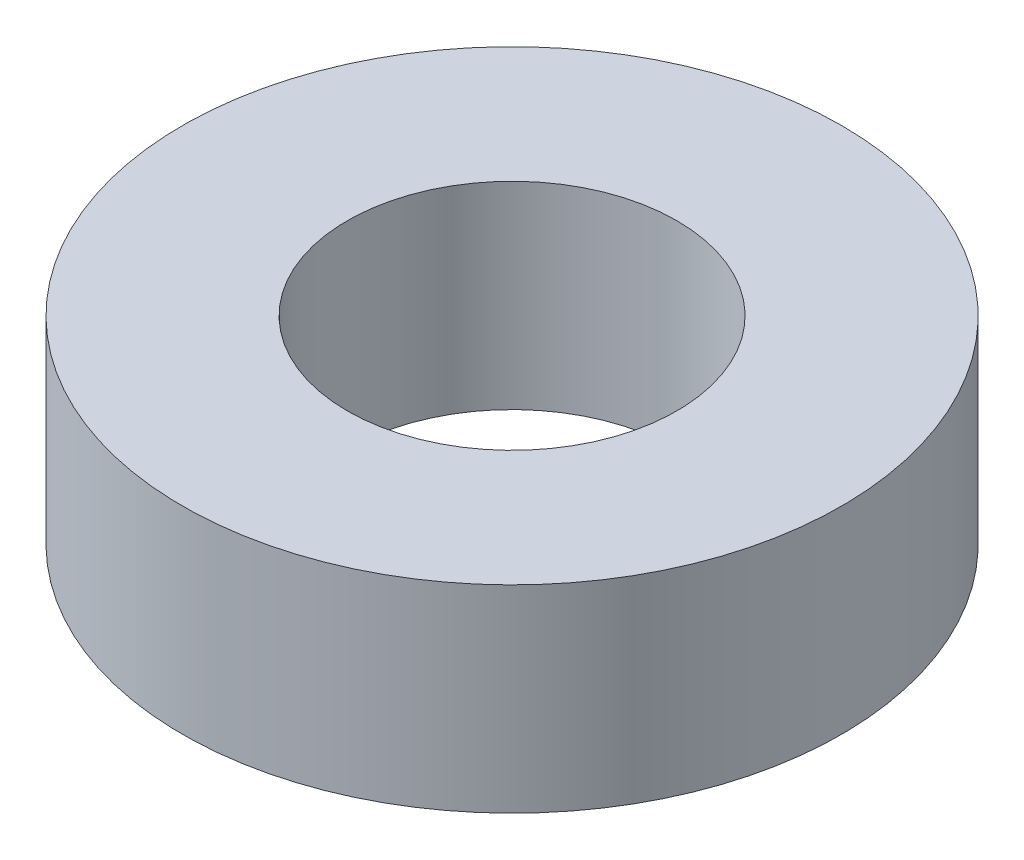
ISO-10303-21;
HEADER;
FILE_DESCRIPTION(('STEP AP214'),'2;1');
FILE_NAME('part.step','',(''),(''),'','','');
FILE_SCHEMA(('AUTOMOTIVE_DESIGN { 1 0 10303 214 1 1 1 1 }'));
ENDSEC;
DATA;
#1=APPLICATION_CONTEXT('core data for automotive mechanical design processes');
#2=APPLICATION_PROTOCOL_DEFINITION('international standard','automotive_design',2000,#1);
#3=PRODUCT_CONTEXT('',#1,'mechanical');
#4=PRODUCT('Part','Part','',(#3));
#5=PRODUCT_RELATED_PRODUCT_CATEGORY('part','',(#4));
#6=PRODUCT_DEFINITION_FORMATION('','',#4);
#7=PRODUCT_DEFINITION_CONTEXT('part definition',#1,'design');
#8=PRODUCT_DEFINITION('design','',#6,#7);
#9=PRODUCT_DEFINITION_SHAPE('','',#8);
#10=(LENGTH_UNIT() NAMED_UNIT(*) SI_UNIT(.MILLI.,.METRE.));
#11=(NAMED_UNIT(*) PLANE_ANGLE_UNIT() SI_UNIT($,.RADIAN.));
#12=(NAMED_UNIT(*) SI_UNIT($,.STERADIAN.) SOLID_ANGLE_UNIT());
#13=UNCERTAINTY_MEASURE_WITH_UNIT(LENGTH_MEASURE(1.E-05),#10,'distance_accuracy_value','');
#14=(GEOMETRIC_REPRESENTATION_CONTEXT(3) GLOBAL_UNCERTAINTY_ASSIGNED_CONTEXT((#13)) GLOBAL_UNIT_ASSIGNED_CONTEXT((#10,
#11,#12)) REPRESENTATION_CONTEXT('',''));
#15=CARTESIAN_POINT('',(0.,0.,0.));
#16=DIRECTION('',(0.,0.,1.));
#17=DIRECTION('',(1.,0.,0.));
#18=AXIS2_PLACEMENT_3D('',#15,#16,#17);
#19=CARTESIAN_POINT('',(0.,3.81,0.));
#20=DIRECTION('',(0.,1.,0.));
#21=DIRECTION('',(0.,0.,1.));
#22=AXIS2_PLACEMENT_3D('',#19,#20,#21);
#23=PLANE('',#22);
#24=CARTESIAN_POINT('',(0.,3.81,0.));
#25=DIRECTION('',(0.,1.,0.));
#26=DIRECTION('',(0.,0.,1.));
#27=AXIS2_PLACEMENT_3D('',#24,#25,#26);
#28=CIRCLE('',#27,6.35);
#29=CARTESIAN_POINT('',(0.,3.81,-6.35));
#30=VERTEX_POINT('',#29);
#31=EDGE_CURVE('E10',#30,#30,#28,.T.);
#32=ORIENTED_EDGE('',*,*,#31,.T.);
#33=EDGE_LOOP('',(#32));
#34=FACE_BOUND('',#33,.T.);
#35=CARTESIAN_POINT('',(0.,3.81,0.));
#36=DIRECTION('',(0.,1.,0.));
#37=DIRECTION('',(0.,0.,1.));
#38=AXIS2_PLACEMENT_3D('',#35,#36,#37);
#39=CIRCLE('',#38,3.175);
#40=CARTESIAN_POINT('',(0.,3.81,-3.175));
#41=VERTEX_POINT('',#40);
#42=EDGE_CURVE('E45',#41,#41,#39,.T.);
#43=ORIENTED_EDGE('',*,*,#42,.F.);
#44=EDGE_LOOP('',(#43));
#45=FACE_BOUND('',#44,.T.);
#46=ADVANCED_FACE('F34',(#34,#45),#23,.T.);
#47=CARTESIAN_POINT('',(0.,0.,0.));
#48=DIRECTION('',(0.,1.,0.));
#49=DIRECTION('',(0.,0.,1.));
#50=AXIS2_PLACEMENT_3D('',#47,#48,#49);
#51=PLANE('',#50);
#52=CARTESIAN_POINT('',(0.,0.,0.));
#53=DIRECTION('',(0.,1.,0.));
#54=DIRECTION('',(0.,0.,1.));
#55=AXIS2_PLACEMENT_3D('',#52,#53,#54);
#56=CIRCLE('',#55,6.35);
#57=CARTESIAN_POINT('',(0.,0.,-6.35));
#58=VERTEX_POINT('',#57);
#59=EDGE_CURVE('E38',#58,#58,#56,.T.);
#60=ORIENTED_EDGE('',*,*,#59,.F.);
#61=EDGE_LOOP('',(#60));
#62=FACE_BOUND('',#61,.T.);
#63=CARTESIAN_POINT('',(0.,0.,0.));
#64=DIRECTION('',(0.,1.,0.));
#65=DIRECTION('',(0.,0.,1.));
#66=AXIS2_PLACEMENT_3D('',#63,#64,#65);
#67=CIRCLE('',#66,3.175);
#68=CARTESIAN_POINT('',(0.,0.,-3.175));
#69=VERTEX_POINT('',#68);
#70=EDGE_CURVE('E47',#69,#69,#67,.T.);
#71=ORIENTED_EDGE('',*,*,#70,.T.);
#72=EDGE_LOOP('',(#71));
#73=FACE_BOUND('',#72,.T.);
#74=ADVANCED_FACE('F57',(#62,#73),#51,.F.);
#75=CARTESIAN_POINT('',(0.,3.81,0.));
#76=DIRECTION('',(0.,-1.,0.));
#77=DIRECTION('',(0.,0.,-1.));
#78=AXIS2_PLACEMENT_3D('',#75,#76,#77);
#79=CYLINDRICAL_SURFACE('',#78,6.35);
#80=CARTESIAN_POINT('',(0.,3.81,-6.35));
#81=CARTESIAN_POINT('',(0.,3.7703125,-6.35));
#82=CARTESIAN_POINT('',(0.,3.730625,-6.35));
#83=CARTESIAN_POINT('',(0.,3.65125,-6.35));
#84=CARTESIAN_POINT('',(0.,3.6115625,-6.35));
#85=CARTESIAN_POINT('',(0.,3.5321875,-6.35));
#86=CARTESIAN_POINT('',(0.,3.4925,-6.35));
#87=CARTESIAN_POINT('',(0.,3.413125,-6.35));
#88=CARTESIAN_POINT('',(0.,3.3734375,-6.35));
#89=CARTESIAN_POINT('',(0.,3.2940625,-6.35));
#90=CARTESIAN_POINT('',(0.,3.254375,-6.35));
#91=CARTESIAN_POINT('',(0.,3.175,-6.35));
#92=CARTESIAN_POINT('',(0.,3.1353125,-6.35));
#93=CARTESIAN_POINT('',(0.,3.0559375,-6.35));
#94=CARTESIAN_POINT('',(0.,3.01625,-6.35));
#95=CARTESIAN_POINT('',(0.,2.936875,-6.35));
#96=CARTESIAN_POINT('',(0.,2.8971875,-6.35));
#97=CARTESIAN_POINT('',(0.,2.8178125,-6.35));
#98=CARTESIAN_POINT('',(0.,2.778125,-6.35));
#99=CARTESIAN_POINT('',(0.,2.69875,-6.35));
#100=CARTESIAN_POINT('',(0.,2.6590625,-6.35));
#101=CARTESIAN_POINT('',(0.,2.5796875,-6.35));
#102=CARTESIAN_POINT('',(0.,2.54,-6.35));
#103=CARTESIAN_POINT('',(0.,2.460625,-6.35));
#104=CARTESIAN_POINT('',(0.,2.4209375,-6.35));
#105=CARTESIAN_POINT('',(0.,2.3415625,-6.35));
#106=CARTESIAN_POINT('',(0.,2.301875,-6.35));
#107=CARTESIAN_POINT('',(0.,2.2225,-6.35));
#108=CARTESIAN_POINT('',(0.,2.1828125,-6.35));
#109=CARTESIAN_POINT('',(0.,2.1034375,-6.35));
#110=CARTESIAN_POINT('',(0.,2.06375,-6.35));
#111=CARTESIAN_POINT('',(0.,1.984375,-6.35));
#112=CARTESIAN_POINT('',(0.,1.9446875,-6.35));
#113=CARTESIAN_POINT('',(0.,1.8653125,-6.35));
#114=CARTESIAN_POINT('',(0.,1.825625,-6.35));
#115=CARTESIAN_POINT('',(0.,1.74625,-6.35));
#116=CARTESIAN_POINT('',(0.,1.7065625,-6.35));
#117=CARTESIAN_POINT('',(0.,1.6271875,-6.35));
#118=CARTESIAN_POINT('',(0.,1.5875,-6.35));
#119=CARTESIAN_POINT('',(0.,1.508125,-6.35));
#120=CARTESIAN_POINT('',(0.,1.4684375,-6.35));
#121=CARTESIAN_POINT('',(0.,1.3890625,-6.35));
#122=CARTESIAN_POINT('',(0.,1.349375,-6.35));
#123=CARTESIAN_POINT('',(0.,1.27,-6.35));
#124=CARTESIAN_POINT('',(0.,1.2303125,-6.35));
#125=CARTESIAN_POINT('',(0.,1.1509375,-6.35));
#126=CARTESIAN_POINT('',(0.,1.11125,-6.35));
#127=CARTESIAN_POINT('',(0.,1.031875,-6.35));
#128=CARTESIAN_POINT('',(0.,0.9921875,-6.35));
#129=CARTESIAN_POINT('',(0.,0.9128125,-6.35));
#130=CARTESIAN_POINT('',(0.,0.873125,-6.35));
#131=CARTESIAN_POINT('',(0.,0.79375,-6.35));
#132=CARTESIAN_POINT('',(0.,0.7540625,-6.35));
#133=CARTESIAN_POINT('',(0.,0.6746875,-6.35));
#134=CARTESIAN_POINT('',(0.,0.635,-6.35));
#135=CARTESIAN_POINT('',(0.,0.555625,-6.35));
#136=CARTESIAN_POINT('',(0.,0.5159375,-6.35));
#137=CARTESIAN_POINT('',(0.,0.4365625,-6.35));
#138=CARTESIAN_POINT('',(0.,0.396875,-6.35));
#139=CARTESIAN_POINT('',(0.,0.3175,-6.35));
#140=CARTESIAN_POINT('',(0.,0.2778125,-6.35));
#141=CARTESIAN_POINT('',(0.,0.1984375,-6.35));
#142=CARTESIAN_POINT('',(0.,0.15875,-6.35));
#143=CARTESIAN_POINT('',(0.,0.0793749999999999,-6.35));
#144=CARTESIAN_POINT('',(0.,0.0396874999999999,-6.35));
#145=CARTESIAN_POINT('',(0.,0.,-6.35));
#146=B_SPLINE_CURVE_WITH_KNOTS('',3,(#80,#81,#82,#83,#84,#85,#86,#87,#88,#89,#90,#91,#92,#93,
#94,#95,#96,#97,#98,#99,#100,#101,#102,#103,#104,#105,#106,#107,#108,#109,#110,#111,#112,#113,
#114,#115,#116,#117,#118,#119,#120,#121,#122,#123,#124,#125,#126,#127,#128,#129,#130,#131,#132,
#133,#134,#135,#136,#137,#138,#139,#140,#141,#142,#143,#144,#145),.UNSPECIFIED.,.F.,.F.,(4,2,2,
2,2,2,2,2,2,2,2,2,2,2,2,2,2,2,2,2,2,2,2,2,2,2,2,2,2,2,2,2,4),(0.,0.1190625,0.238125,0.3571875,
0.47625,0.5953125,0.714375,0.8334375,0.9525,1.0715625,1.190625,1.3096875,1.42875,1.5478125,
1.666875,1.7859375,1.905,2.0240625,2.143125,2.2621875,2.38125,2.5003125,2.619375,2.7384375,
2.8575,2.9765625,3.095625,3.2146875,3.33375,3.4528125,3.571875,3.6909375,3.81),.UNSPECIFIED.);
#147=EDGE_CURVE('BSEAM36',#30,#58,#146,.T.);
#148=ORIENTED_EDGE('',*,*,#31,.F.);
#149=ORIENTED_EDGE('',*,*,#59,.T.);
#150=ORIENTED_EDGE('',*,*,#147,.T.);
#151=ORIENTED_EDGE('',*,*,#147,.F.);
#152=EDGE_LOOP('',(#148,#150,#149,#151));
#153=FACE_BOUND('',#152,.T.);
#154=ADVANCED_FACE('F36',(#153),#79,.T.);
#155=CARTESIAN_POINT('',(0.,3.81,0.));
#156=DIRECTION('',(0.,-1.,0.));
#157=DIRECTION('',(0.,0.,-1.));
#158=AXIS2_PLACEMENT_3D('',#155,#156,#157);
#159=CYLINDRICAL_SURFACE('',#158,3.175);
#160=CARTESIAN_POINT('',(0.,3.81,-3.175));
#161=CARTESIAN_POINT('',(0.,3.7703125,-3.175));
#162=CARTESIAN_POINT('',(0.,3.730625,-3.175));
#163=CARTESIAN_POINT('',(0.,3.65125,-3.175));
#164=CARTESIAN_POINT('',(0.,3.6115625,-3.175));
#165=CARTESIAN_POINT('',(0.,3.5321875,-3.175));
#166=CARTESIAN_POINT('',(0.,3.4925,-3.175));
#167=CARTESIAN_POINT('',(0.,3.413125,-3.175));
#168=CARTESIAN_POINT('',(0.,3.3734375,-3.175));
#169=CARTESIAN_POINT('',(0.,3.2940625,-3.175));
#170=CARTESIAN_POINT('',(0.,3.254375,-3.175));
#171=CARTESIAN_POINT('',(0.,3.175,-3.175));
#172=CARTESIAN_POINT('',(0.,3.1353125,-3.175));
#173=CARTESIAN_POINT('',(0.,3.0559375,-3.175));
#174=CARTESIAN_POINT('',(0.,3.01625,-3.175));
#175=CARTESIAN_POINT('',(0.,2.936875,-3.175));
#176=CARTESIAN_POINT('',(0.,2.8971875,-3.175));
#177=CARTESIAN_POINT('',(0.,2.8178125,-3.175));
#178=CARTESIAN_POINT('',(0.,2.778125,-3.175));
#179=CARTESIAN_POINT('',(0.,2.69875,-3.175));
#180=CARTESIAN_POINT('',(0.,2.6590625,-3.175));
#181=CARTESIAN_POINT('',(0.,2.5796875,-3.175));
#182=CARTESIAN_POINT('',(0.,2.54,-3.175));
#183=CARTESIAN_POINT('',(0.,2.460625,-3.175));
#184=CARTESIAN_POINT('',(0.,2.4209375,-3.175));
#185=CARTESIAN_POINT('',(0.,2.3415625,-3.175));
#186=CARTESIAN_POINT('',(0.,2.301875,-3.175));
#187=CARTESIAN_POINT('',(0.,2.2225,-3.175));
#188=CARTESIAN_POINT('',(0.,2.1828125,-3.175));
#189=CARTESIAN_POINT('',(0.,2.1034375,-3.175));
#190=CARTESIAN_POINT('',(0.,2.06375,-3.175));
#191=CARTESIAN_POINT('',(0.,1.984375,-3.175));
#192=CARTESIAN_POINT('',(0.,1.9446875,-3.175));
#193=CARTESIAN_POINT('',(0.,1.8653125,-3.175));
#194=CARTESIAN_POINT('',(0.,1.825625,-3.175));
#195=CARTESIAN_POINT('',(0.,1.74625,-3.175));
#196=CARTESIAN_POINT('',(0.,1.7065625,-3.175));
#197=CARTESIAN_POINT('',(0.,1.6271875,-3.175));
#198=CARTESIAN_POINT('',(0.,1.5875,-3.175));
#199=CARTESIAN_POINT('',(0.,1.508125,-3.175));
#200=CARTESIAN_POINT('',(0.,1.4684375,-3.175));
#201=CARTESIAN_POINT('',(0.,1.3890625,-3.175));
#202=CARTESIAN_POINT('',(0.,1.349375,-3.175));
#203=CARTESIAN_POINT('',(0.,1.27,-3.175));
#204=CARTESIAN_POINT('',(0.,1.2303125,-3.175));
#205=CARTESIAN_POINT('',(0.,1.1509375,-3.175));
#206=CARTESIAN_POINT('',(0.,1.11125,-3.175));
#207=CARTESIAN_POINT('',(0.,1.031875,-3.175));
#208=CARTESIAN_POINT('',(0.,0.9921875,-3.175));
#209=CARTESIAN_POINT('',(0.,0.9128125,-3.175));
#210=CARTESIAN_POINT('',(0.,0.873125,-3.175));
#211=CARTESIAN_POINT('',(0.,0.79375,-3.175));
#212=CARTESIAN_POINT('',(0.,0.7540625,-3.175));
#213=CARTESIAN_POINT('',(0.,0.6746875,-3.175));
#214=CARTESIAN_POINT('',(0.,0.635,-3.175));
#215=CARTESIAN_POINT('',(0.,0.555625,-3.175));
#216=CARTESIAN_POINT('',(0.,0.5159375,-3.175));
#217=CARTESIAN_POINT('',(0.,0.4365625,-3.175));
#218=CARTESIAN_POINT('',(0.,0.396875,-3.175));
#219=CARTESIAN_POINT('',(0.,0.3175,-3.175));
#220=CARTESIAN_POINT('',(0.,0.2778125,-3.175));
#221=CARTESIAN_POINT('',(0.,0.1984375,-3.175));
#222=CARTESIAN_POINT('',(0.,0.15875,-3.175));
#223=CARTESIAN_POINT('',(0.,0.0793749999999999,-3.175));
#224=CARTESIAN_POINT('',(0.,0.0396874999999999,-3.175));
#225=CARTESIAN_POINT('',(0.,0.,-3.175));
#226=B_SPLINE_CURVE_WITH_KNOTS('',3,(#160,#161,#162,#163,#164,#165,#166,#167,#168,#169,#170,
#171,#172,#173,#174,#175,#176,#177,#178,#179,#180,#181,#182,#183,#184,#185,#186,#187,#188,#189,
#190,#191,#192,#193,#194,#195,#196,#197,#198,#199,#200,#201,#202,#203,#204,#205,#206,#207,#208,
#209,#210,#211,#212,#213,#214,#215,#216,#217,#218,#219,#220,#221,#222,#223,#224,#225),
.UNSPECIFIED.,.F.,.F.,(4,2,2,2,2,2,2,2,2,2,2,2,2,2,2,2,2,2,2,2,2,2,2,2,2,2,2,2,2,2,2,2,4),(0.,
0.1190625,0.238125,0.3571875,0.47625,0.595312499999999,0.714375,0.833437499999999,
0.952499999999999,1.0715625,1.190625,1.3096875,1.42875,1.5478125,1.666875,1.7859375,1.905,
2.0240625,2.143125,2.2621875,2.38125,2.5003125,2.619375,2.7384375,2.8575,2.9765625,3.095625,
3.2146875,3.33375,3.4528125,3.571875,3.6909375,3.81),.UNSPECIFIED.);
#227=EDGE_CURVE('BSEAM53',#41,#69,#226,.T.);
#228=ORIENTED_EDGE('',*,*,#42,.T.);
#229=ORIENTED_EDGE('',*,*,#70,.F.);
#230=ORIENTED_EDGE('',*,*,#227,.T.);
#231=ORIENTED_EDGE('',*,*,#227,.F.);
#232=EDGE_LOOP('',(#228,#230,#229,#231));
#233=FACE_BOUND('',#232,.T.);
#234=ADVANCED_FACE('F53',(#233),#159,.F.);
#235=CLOSED_SHELL('',(#46,#74,#154,#234));
#236=MANIFOLD_SOLID_BREP('B2',#235);
#237=ADVANCED_BREP_SHAPE_REPRESENTATION('',(#18,#236),#14);
#238=SHAPE_DEFINITION_REPRESENTATION(#9,#237);
ENDSEC;
END-ISO-10303-21;
